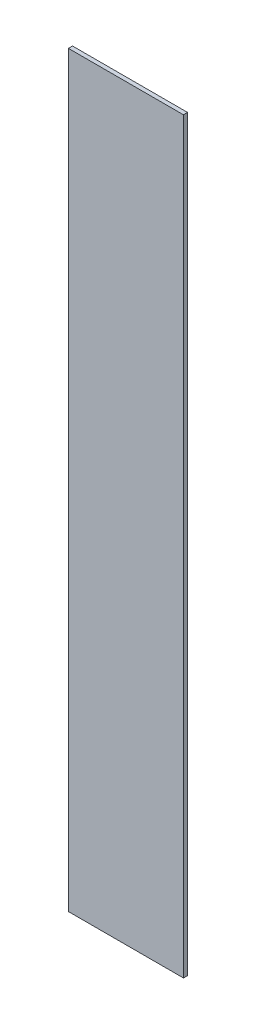
ISO-10303-21;
HEADER;
FILE_DESCRIPTION(('STEP AP214'),'2;1');
FILE_NAME('part.step','',(''),(''),'','','');
FILE_SCHEMA(('AUTOMOTIVE_DESIGN { 1 0 10303 214 1 1 1 1 }'));
ENDSEC;
DATA;
#1=APPLICATION_CONTEXT('core data for automotive mechanical design processes');
#2=APPLICATION_PROTOCOL_DEFINITION('international standard','automotive_design',2000,#1);
#3=PRODUCT_CONTEXT('',#1,'mechanical');
#4=PRODUCT('Part','Part','',(#3));
#5=PRODUCT_RELATED_PRODUCT_CATEGORY('part','',(#4));
#6=PRODUCT_DEFINITION_FORMATION('','',#4);
#7=PRODUCT_DEFINITION_CONTEXT('part definition',#1,'design');
#8=PRODUCT_DEFINITION('design','',#6,#7);
#9=PRODUCT_DEFINITION_SHAPE('','',#8);
#10=(LENGTH_UNIT() NAMED_UNIT(*) SI_UNIT(.MILLI.,.METRE.));
#11=(NAMED_UNIT(*) PLANE_ANGLE_UNIT() SI_UNIT($,.RADIAN.));
#12=(NAMED_UNIT(*) SI_UNIT($,.STERADIAN.) SOLID_ANGLE_UNIT());
#13=UNCERTAINTY_MEASURE_WITH_UNIT(LENGTH_MEASURE(1.E-05),#10,'distance_accuracy_value','');
#14=(GEOMETRIC_REPRESENTATION_CONTEXT(3) GLOBAL_UNCERTAINTY_ASSIGNED_CONTEXT((#13)) GLOBAL_UNIT_ASSIGNED_CONTEXT((#10,
#11,#12)) REPRESENTATION_CONTEXT('',''));
#15=CARTESIAN_POINT('',(0.,0.,0.));
#16=DIRECTION('',(0.,0.,1.));
#17=DIRECTION('',(1.,0.,0.));
#18=AXIS2_PLACEMENT_3D('',#15,#16,#17);
#19=CARTESIAN_POINT('',(293.,1469.,27.));
#20=DIRECTION('',(1.,0.,0.));
#21=DIRECTION('',(0.,0.,-1.));
#22=AXIS2_PLACEMENT_3D('',#19,#20,#21);
#23=PLANE('',#22);
#24=DIRECTION('',(0.,-1.,0.));
#25=VECTOR('',#24,1.);
#26=CARTESIAN_POINT('',(293.,1469.,26.));
#27=LINE('',#26,#25);
#28=CARTESIAN_POINT('',(293.,1651.,26.));
#29=VERTEX_POINT('',#28);
#30=CARTESIAN_POINT('',(293.,1469.,26.));
#31=VERTEX_POINT('',#30);
#32=EDGE_CURVE('E102',#29,#31,#27,.T.);
#33=ORIENTED_EDGE('',*,*,#32,.T.);
#34=DIRECTION('',(0.,0.,-1.));
#35=VECTOR('',#34,1.);
#36=CARTESIAN_POINT('',(293.,1469.,27.));
#37=LINE('',#36,#35);
#38=CARTESIAN_POINT('',(293.,1469.,27.));
#39=VERTEX_POINT('',#38);
#40=EDGE_CURVE('E11',#39,#31,#37,.T.);
#41=ORIENTED_EDGE('',*,*,#40,.F.);
#42=DIRECTION('',(0.,-1.,0.));
#43=VECTOR('',#42,1.);
#44=CARTESIAN_POINT('',(293.,1469.,27.));
#45=LINE('',#44,#43);
#46=CARTESIAN_POINT('',(293.,1651.,27.));
#47=VERTEX_POINT('',#46);
#48=EDGE_CURVE('E90',#47,#39,#45,.T.);
#49=ORIENTED_EDGE('',*,*,#48,.F.);
#50=DIRECTION('',(0.,0.,-1.));
#51=VECTOR('',#50,1.);
#52=CARTESIAN_POINT('',(293.,1651.,27.));
#53=LINE('',#52,#51);
#54=EDGE_CURVE('E98',#47,#29,#53,.T.);
#55=ORIENTED_EDGE('',*,*,#54,.T.);
#56=EDGE_LOOP('',(#33,#41,#49,#55));
#57=FACE_BOUND('',#56,.T.);
#58=ADVANCED_FACE('F39',(#57),#23,.F.);
#59=CARTESIAN_POINT('',(293.,1469.,27.));
#60=DIRECTION('',(0.,1.,0.));
#61=DIRECTION('',(0.,0.,1.));
#62=AXIS2_PLACEMENT_3D('',#59,#60,#61);
#63=PLANE('',#62);
#64=DIRECTION('',(1.,0.,0.));
#65=VECTOR('',#64,1.);
#66=CARTESIAN_POINT('',(293.,1469.,26.));
#67=LINE('',#66,#65);
#68=CARTESIAN_POINT('',(321.,1469.,26.));
#69=VERTEX_POINT('',#68);
#70=EDGE_CURVE('E94',#31,#69,#67,.T.);
#71=ORIENTED_EDGE('',*,*,#70,.T.);
#72=DIRECTION('',(0.,0.,-1.));
#73=VECTOR('',#72,1.);
#74=CARTESIAN_POINT('',(321.,1469.,27.));
#75=LINE('',#74,#73);
#76=CARTESIAN_POINT('',(321.,1469.,27.));
#77=VERTEX_POINT('',#76);
#78=EDGE_CURVE('E47',#77,#69,#75,.T.);
#79=ORIENTED_EDGE('',*,*,#78,.F.);
#80=DIRECTION('',(1.,0.,0.));
#81=VECTOR('',#80,1.);
#82=CARTESIAN_POINT('',(293.,1469.,27.));
#83=LINE('',#82,#81);
#84=EDGE_CURVE('E85',#39,#77,#83,.T.);
#85=ORIENTED_EDGE('',*,*,#84,.F.);
#86=ORIENTED_EDGE('',*,*,#40,.T.);
#87=EDGE_LOOP('',(#71,#79,#85,#86));
#88=FACE_BOUND('',#87,.T.);
#89=ADVANCED_FACE('F93',(#88),#63,.F.);
#90=CARTESIAN_POINT('',(321.,1469.,27.));
#91=DIRECTION('',(-1.,0.,0.));
#92=DIRECTION('',(0.,0.,1.));
#93=AXIS2_PLACEMENT_3D('',#90,#91,#92);
#94=PLANE('',#93);
#95=DIRECTION('',(0.,1.,0.));
#96=VECTOR('',#95,1.);
#97=CARTESIAN_POINT('',(321.,1469.,26.));
#98=LINE('',#97,#96);
#99=CARTESIAN_POINT('',(321.,1651.,26.));
#100=VERTEX_POINT('',#99);
#101=EDGE_CURVE('E72',#69,#100,#98,.T.);
#102=ORIENTED_EDGE('',*,*,#101,.T.);
#103=DIRECTION('',(0.,0.,-1.));
#104=VECTOR('',#103,1.);
#105=CARTESIAN_POINT('',(321.,1651.,27.));
#106=LINE('',#105,#104);
#107=CARTESIAN_POINT('',(321.,1651.,27.));
#108=VERTEX_POINT('',#107);
#109=EDGE_CURVE('E95',#108,#100,#106,.T.);
#110=ORIENTED_EDGE('',*,*,#109,.F.);
#111=DIRECTION('',(0.,1.,0.));
#112=VECTOR('',#111,1.);
#113=CARTESIAN_POINT('',(321.,1469.,27.));
#114=LINE('',#113,#112);
#115=EDGE_CURVE('E88',#77,#108,#114,.T.);
#116=ORIENTED_EDGE('',*,*,#115,.F.);
#117=ORIENTED_EDGE('',*,*,#78,.T.);
#118=EDGE_LOOP('',(#102,#110,#116,#117));
#119=FACE_BOUND('',#118,.T.);
#120=ADVANCED_FACE('F96',(#119),#94,.F.);
#121=CARTESIAN_POINT('',(293.,1651.,27.));
#122=DIRECTION('',(0.,-1.,0.));
#123=DIRECTION('',(0.,0.,-1.));
#124=AXIS2_PLACEMENT_3D('',#121,#122,#123);
#125=PLANE('',#124);
#126=DIRECTION('',(-1.,0.,0.));
#127=VECTOR('',#126,1.);
#128=CARTESIAN_POINT('',(293.,1651.,26.));
#129=LINE('',#128,#127);
#130=EDGE_CURVE('E78',#100,#29,#129,.T.);
#131=ORIENTED_EDGE('',*,*,#130,.T.);
#132=ORIENTED_EDGE('',*,*,#54,.F.);
#133=DIRECTION('',(-1.,0.,0.));
#134=VECTOR('',#133,1.);
#135=CARTESIAN_POINT('',(293.,1651.,27.));
#136=LINE('',#135,#134);
#137=EDGE_CURVE('E55',#108,#47,#136,.T.);
#138=ORIENTED_EDGE('',*,*,#137,.F.);
#139=ORIENTED_EDGE('',*,*,#109,.T.);
#140=EDGE_LOOP('',(#131,#132,#138,#139));
#141=FACE_BOUND('',#140,.T.);
#142=ADVANCED_FACE('F109',(#141),#125,.F.);
#143=CARTESIAN_POINT('',(0.,0.,27.));
#144=DIRECTION('',(0.,0.,-1.));
#145=DIRECTION('',(-1.,0.,0.));
#146=AXIS2_PLACEMENT_3D('',#143,#144,#145);
#147=PLANE('',#146);
#148=ORIENTED_EDGE('',*,*,#48,.T.);
#149=ORIENTED_EDGE('',*,*,#84,.T.);
#150=ORIENTED_EDGE('',*,*,#115,.T.);
#151=ORIENTED_EDGE('',*,*,#137,.T.);
#152=EDGE_LOOP('',(#148,#149,#150,#151));
#153=FACE_BOUND('',#152,.T.);
#154=ADVANCED_FACE('F86',(#153),#147,.F.);
#155=CARTESIAN_POINT('',(0.,0.,26.));
#156=DIRECTION('',(0.,0.,-1.));
#157=DIRECTION('',(-1.,0.,0.));
#158=AXIS2_PLACEMENT_3D('',#155,#156,#157);
#159=PLANE('',#158);
#160=ORIENTED_EDGE('',*,*,#32,.F.);
#161=ORIENTED_EDGE('',*,*,#130,.F.);
#162=ORIENTED_EDGE('',*,*,#101,.F.);
#163=ORIENTED_EDGE('',*,*,#70,.F.);
#164=EDGE_LOOP('',(#160,#161,#162,#163));
#165=FACE_BOUND('',#164,.T.);
#166=ADVANCED_FACE('F112',(#165),#159,.T.);
#167=CLOSED_SHELL('',(#58,#89,#120,#142,#154,#166));
#168=MANIFOLD_SOLID_BREP('B2',#167);
#169=ADVANCED_BREP_SHAPE_REPRESENTATION('',(#18,#168),#14);
#170=SHAPE_DEFINITION_REPRESENTATION(#9,#169);
ENDSEC;
END-ISO-10303-21;
